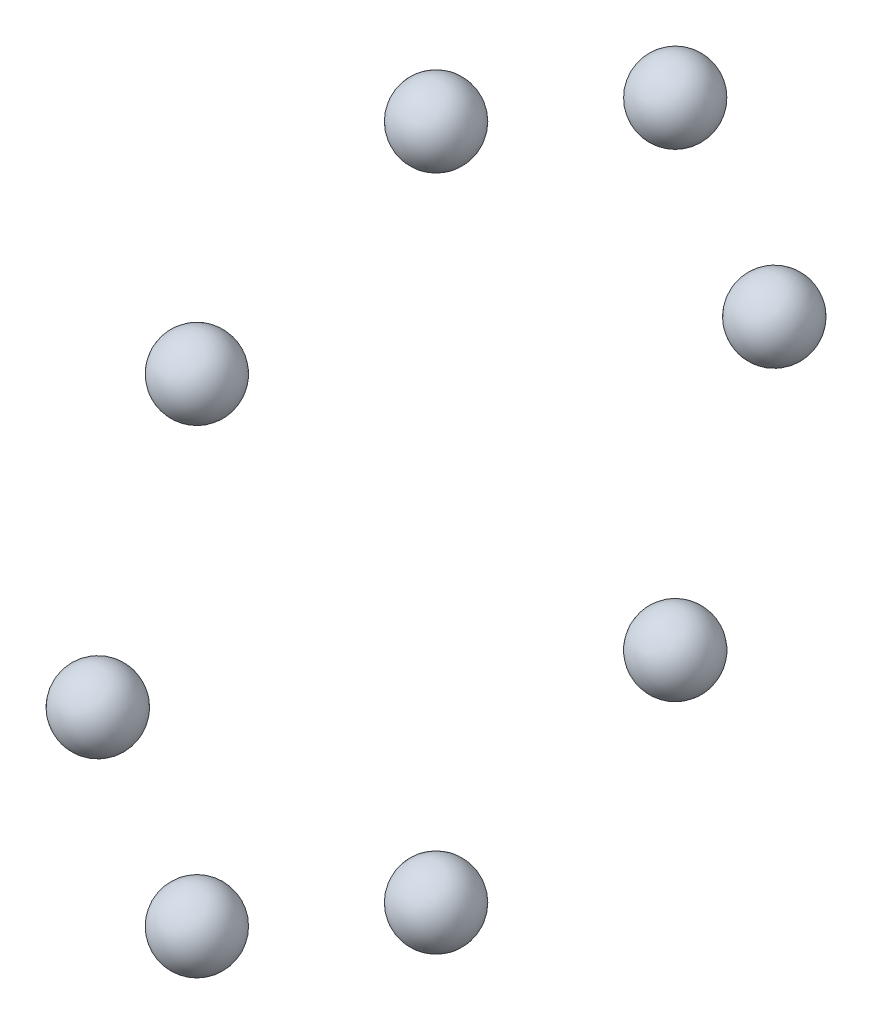
ISO-10303-21;
HEADER;
FILE_DESCRIPTION(('STEP AP214'),'2;1');
FILE_NAME('part.step','',(''),(''),'','','');
FILE_SCHEMA(('AUTOMOTIVE_DESIGN { 1 0 10303 214 1 1 1 1 }'));
ENDSEC;
DATA;
#1=APPLICATION_CONTEXT('core data for automotive mechanical design processes');
#2=APPLICATION_PROTOCOL_DEFINITION('international standard','automotive_design',2000,#1);
#3=PRODUCT_CONTEXT('',#1,'mechanical');
#4=PRODUCT('Part','Part','',(#3));
#5=PRODUCT_RELATED_PRODUCT_CATEGORY('part','',(#4));
#6=PRODUCT_DEFINITION_FORMATION('','',#4);
#7=PRODUCT_DEFINITION_CONTEXT('part definition',#1,'design');
#8=PRODUCT_DEFINITION('design','',#6,#7);
#9=PRODUCT_DEFINITION_SHAPE('','',#8);
#10=(LENGTH_UNIT() NAMED_UNIT(*) SI_UNIT(.MILLI.,.METRE.));
#11=(NAMED_UNIT(*) PLANE_ANGLE_UNIT() SI_UNIT($,.RADIAN.));
#12=(NAMED_UNIT(*) SI_UNIT($,.STERADIAN.) SOLID_ANGLE_UNIT());
#13=UNCERTAINTY_MEASURE_WITH_UNIT(LENGTH_MEASURE(1.E-05),#10,'distance_accuracy_value','');
#14=(GEOMETRIC_REPRESENTATION_CONTEXT(3) GLOBAL_UNCERTAINTY_ASSIGNED_CONTEXT((#13)) GLOBAL_UNIT_ASSIGNED_CONTEXT((#10,
#11,#12)) REPRESENTATION_CONTEXT('',''));
#15=CARTESIAN_POINT('',(0.,0.,0.));
#16=DIRECTION('',(0.,0.,1.));
#17=DIRECTION('',(1.,0.,0.));
#18=AXIS2_PLACEMENT_3D('',#15,#16,#17);
#19=CARTESIAN_POINT('',(0.,38.5938881171622,-38.5938881171613));
#20=DIRECTION('',(0.,-0.707106781186556,0.707106781186539));
#21=DIRECTION('',(-1.,0.,0.));
#22=AXIS2_PLACEMENT_3D('',#19,#20,#21);
#23=SPHERICAL_SURFACE('',#22,5.90265950895154);
#24=CARTESIAN_POINT('',(0.,34.4200775513473,-34.4200775513464));
#25=VERTEX_POINT('',#24);
#26=VERTEX_LOOP('',#25);
#27=FACE_BOUND('',#26,.T.);
#28=ADVANCED_FACE('F38',(#27),#23,.T.);
#29=CLOSED_SHELL('',(#28));
#30=MANIFOLD_SOLID_BREP('B2',#29);
#31=CARTESIAN_POINT('',(0.,5.71695154422175E-13,-54.58));
#32=DIRECTION('',(0.,0.,1.));
#33=DIRECTION('',(-1.,0.,0.));
#34=AXIS2_PLACEMENT_3D('',#31,#32,#33);
#35=SPHERICAL_SURFACE('',#34,5.90265950895154);
#36=CARTESIAN_POINT('',(0.,5.09868077847027E-13,-48.6773404910485));
#37=VERTEX_POINT('',#36);
#38=VERTEX_LOOP('',#37);
#39=FACE_BOUND('',#38,.T.);
#40=ADVANCED_FACE('F59',(#39),#35,.T.);
#41=CLOSED_SHELL('',(#40));
#42=MANIFOLD_SOLID_BREP('B6',#41);
#43=CARTESIAN_POINT('',(0.,-38.5938881171614,-38.5938881171621));
#44=DIRECTION('',(0.,0.707106781186541,0.707106781186554));
#45=DIRECTION('',(-1.,0.,0.));
#46=AXIS2_PLACEMENT_3D('',#43,#44,#45);
#47=SPHERICAL_SURFACE('',#46,5.90265950895154);
#48=CARTESIAN_POINT('',(0.,-34.4200775513466,-34.4200775513472));
#49=VERTEX_POINT('',#48);
#50=VERTEX_LOOP('',#49);
#51=FACE_BOUND('',#50,.T.);
#52=ADVANCED_FACE('F80',(#51),#47,.T.);
#53=CLOSED_SHELL('',(#52));
#54=MANIFOLD_SOLID_BREP('B34',#53);
#55=CARTESIAN_POINT('',(0.,-54.58,0.));
#56=DIRECTION('',(0.,1.,0.));
#57=DIRECTION('',(-1.,0.,0.));
#58=AXIS2_PLACEMENT_3D('',#55,#56,#57);
#59=SPHERICAL_SURFACE('',#58,5.90265950895154);
#60=CARTESIAN_POINT('',(0.,-48.6773404910485,0.));
#61=VERTEX_POINT('',#60);
#62=VERTEX_LOOP('',#61);
#63=FACE_BOUND('',#62,.T.);
#64=ADVANCED_FACE('F101',(#63),#59,.T.);
#65=CLOSED_SHELL('',(#64));
#66=MANIFOLD_SOLID_BREP('B55',#65);
#67=CARTESIAN_POINT('',(0.,-38.593888117162,38.5938881171616));
#68=DIRECTION('',(0.,0.707106781186551,-0.707106781186544));
#69=DIRECTION('',(-1.,0.,0.));
#70=AXIS2_PLACEMENT_3D('',#67,#68,#69);
#71=SPHERICAL_SURFACE('',#70,5.90265950895154);
#72=CARTESIAN_POINT('',(0.,-34.420077551347,34.4200775513467));
#73=VERTEX_POINT('',#72);
#74=VERTEX_LOOP('',#73);
#75=FACE_BOUND('',#74,.T.);
#76=ADVANCED_FACE('F122',(#75),#71,.T.);
#77=CLOSED_SHELL('',(#76));
#78=MANIFOLD_SOLID_BREP('B76',#77);
#79=CARTESIAN_POINT('',(0.,-1.90565051474058E-13,54.58));
#80=DIRECTION('',(0.,0.,-1.));
#81=DIRECTION('',(-1.,0.,0.));
#82=AXIS2_PLACEMENT_3D('',#79,#80,#81);
#83=SPHERICAL_SURFACE('',#82,5.90265950895154);
#84=CARTESIAN_POINT('',(0.,-1.69956025949009E-13,48.6773404910485));
#85=VERTEX_POINT('',#84);
#86=VERTEX_LOOP('',#85);
#87=FACE_BOUND('',#86,.T.);
#88=ADVANCED_FACE('F143',(#87),#83,.T.);
#89=CLOSED_SHELL('',(#88));
#90=MANIFOLD_SOLID_BREP('B97',#89);
#91=CARTESIAN_POINT('',(0.,38.5938881171617,38.5938881171618));
#92=DIRECTION('',(0.,-0.707106781186546,-0.707106781186549));
#93=DIRECTION('',(-1.,0.,0.));
#94=AXIS2_PLACEMENT_3D('',#91,#92,#93);
#95=SPHERICAL_SURFACE('',#94,5.90265950895154);
#96=CARTESIAN_POINT('',(0.,34.4200775513468,34.4200775513469));
#97=VERTEX_POINT('',#96);
#98=VERTEX_LOOP('',#97);
#99=FACE_BOUND('',#98,.T.);
#100=ADVANCED_FACE('F163',(#99),#95,.T.);
#101=CLOSED_SHELL('',(#100));
#102=MANIFOLD_SOLID_BREP('B118',#101);
#103=CARTESIAN_POINT('',(0.,54.58,0.));
#104=DIRECTION('',(0.,-1.,0.));
#105=DIRECTION('',(-1.,0.,0.));
#106=AXIS2_PLACEMENT_3D('',#103,#104,#105);
#107=SPHERICAL_SURFACE('',#106,5.90265950895154);
#108=CARTESIAN_POINT('',(0.,48.6773404910485,0.));
#109=VERTEX_POINT('',#108);
#110=VERTEX_LOOP('',#109);
#111=FACE_BOUND('',#110,.T.);
#112=ADVANCED_FACE('F178',(#111),#107,.T.);
#113=CLOSED_SHELL('',(#112));
#114=MANIFOLD_SOLID_BREP('B139',#113);
#115=ADVANCED_BREP_SHAPE_REPRESENTATION('',(#18,#30,#42,#54,#66,#78,#90,#102,#114),#14);
#116=SHAPE_DEFINITION_REPRESENTATION(#9,#115);
ENDSEC;
END-ISO-10303-21;
